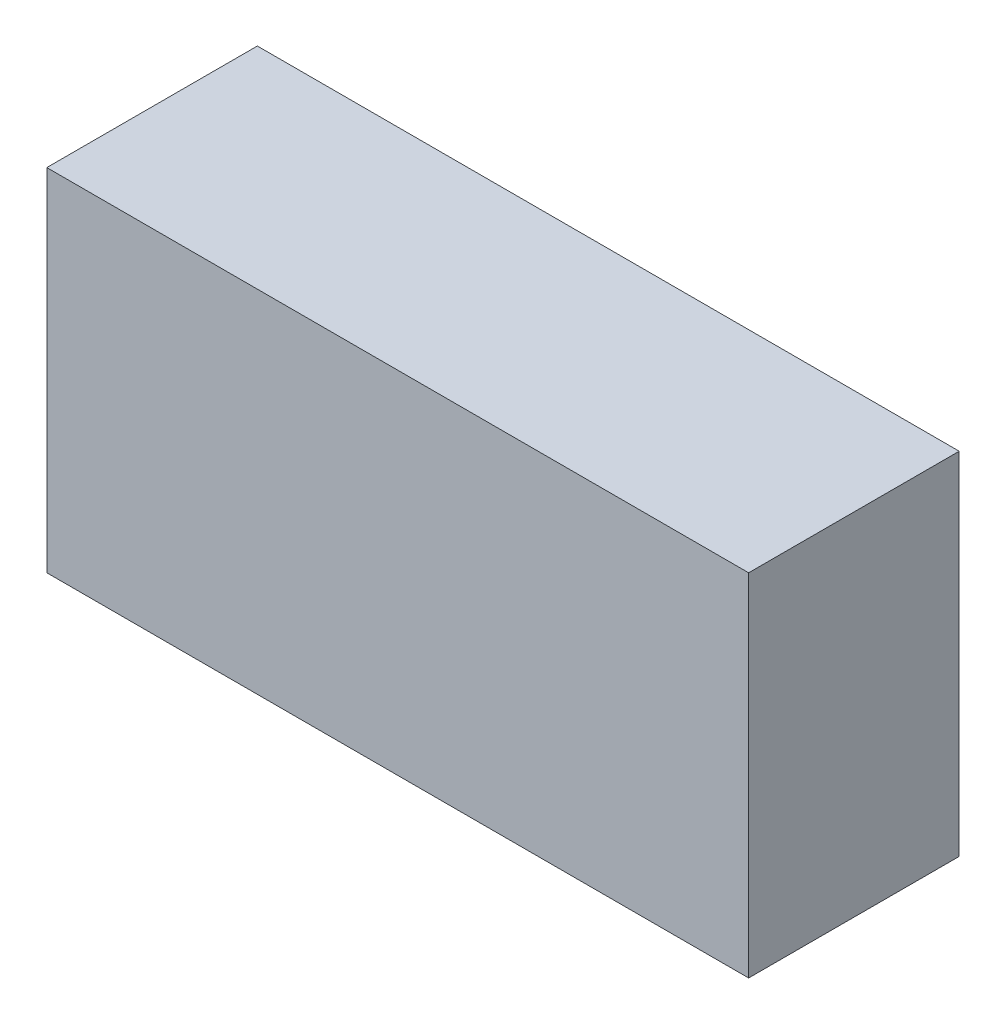
ISO-10303-21;
HEADER;
FILE_DESCRIPTION(('STEP AP214'),'2;1');
FILE_NAME('part.step','',(''),(''),'','','');
FILE_SCHEMA(('AUTOMOTIVE_DESIGN { 1 0 10303 214 1 1 1 1 }'));
ENDSEC;
DATA;
#1=APPLICATION_CONTEXT('core data for automotive mechanical design processes');
#2=APPLICATION_PROTOCOL_DEFINITION('international standard','automotive_design',2000,#1);
#3=PRODUCT_CONTEXT('',#1,'mechanical');
#4=PRODUCT('Part','Part','',(#3));
#5=PRODUCT_RELATED_PRODUCT_CATEGORY('part','',(#4));
#6=PRODUCT_DEFINITION_FORMATION('','',#4);
#7=PRODUCT_DEFINITION_CONTEXT('part definition',#1,'design');
#8=PRODUCT_DEFINITION('design','',#6,#7);
#9=PRODUCT_DEFINITION_SHAPE('','',#8);
#10=(LENGTH_UNIT() NAMED_UNIT(*) SI_UNIT(.MILLI.,.METRE.));
#11=(NAMED_UNIT(*) PLANE_ANGLE_UNIT() SI_UNIT($,.RADIAN.));
#12=(NAMED_UNIT(*) SI_UNIT($,.STERADIAN.) SOLID_ANGLE_UNIT());
#13=UNCERTAINTY_MEASURE_WITH_UNIT(LENGTH_MEASURE(1.E-05),#10,'distance_accuracy_value','');
#14=(GEOMETRIC_REPRESENTATION_CONTEXT(3) GLOBAL_UNCERTAINTY_ASSIGNED_CONTEXT((#13)) GLOBAL_UNIT_ASSIGNED_CONTEXT((#10,
#11,#12)) REPRESENTATION_CONTEXT('',''));
#15=CARTESIAN_POINT('',(0.,0.,0.));
#16=DIRECTION('',(0.,0.,1.));
#17=DIRECTION('',(1.,0.,0.));
#18=AXIS2_PLACEMENT_3D('',#15,#16,#17);
#19=CARTESIAN_POINT('',(50.,-25.,30.));
#20=DIRECTION('',(-1.,0.,0.));
#21=DIRECTION('',(0.,0.,1.));
#22=AXIS2_PLACEMENT_3D('',#19,#20,#21);
#23=PLANE('',#22);
#24=DIRECTION('',(0.,1.,0.));
#25=VECTOR('',#24,1.);
#26=CARTESIAN_POINT('',(50.,-25.,0.));
#27=LINE('',#26,#25);
#28=CARTESIAN_POINT('',(50.,-25.,0.));
#29=VERTEX_POINT('',#28);
#30=CARTESIAN_POINT('',(50.,25.,0.));
#31=VERTEX_POINT('',#30);
#32=EDGE_CURVE('E100',#29,#31,#27,.T.);
#33=ORIENTED_EDGE('',*,*,#32,.T.);
#34=DIRECTION('',(0.,0.,-1.));
#35=VECTOR('',#34,1.);
#36=CARTESIAN_POINT('',(50.,25.,30.));
#37=LINE('',#36,#35);
#38=CARTESIAN_POINT('',(50.,25.,30.));
#39=VERTEX_POINT('',#38);
#40=EDGE_CURVE('E11',#39,#31,#37,.T.);
#41=ORIENTED_EDGE('',*,*,#40,.F.);
#42=DIRECTION('',(0.,1.,0.));
#43=VECTOR('',#42,1.);
#44=CARTESIAN_POINT('',(50.,-25.,30.));
#45=LINE('',#44,#43);
#46=CARTESIAN_POINT('',(50.,-25.,30.));
#47=VERTEX_POINT('',#46);
#48=EDGE_CURVE('E88',#47,#39,#45,.T.);
#49=ORIENTED_EDGE('',*,*,#48,.F.);
#50=DIRECTION('',(0.,0.,-1.));
#51=VECTOR('',#50,1.);
#52=CARTESIAN_POINT('',(50.,-25.,30.));
#53=LINE('',#52,#51);
#54=EDGE_CURVE('E96',#47,#29,#53,.T.);
#55=ORIENTED_EDGE('',*,*,#54,.T.);
#56=EDGE_LOOP('',(#33,#41,#49,#55));
#57=FACE_BOUND('',#56,.T.);
#58=ADVANCED_FACE('F37',(#57),#23,.F.);
#59=CARTESIAN_POINT('',(-50.,25.,30.));
#60=DIRECTION('',(0.,-1.,0.));
#61=DIRECTION('',(0.,0.,-1.));
#62=AXIS2_PLACEMENT_3D('',#59,#60,#61);
#63=PLANE('',#62);
#64=DIRECTION('',(-1.,0.,0.));
#65=VECTOR('',#64,1.);
#66=CARTESIAN_POINT('',(-50.,25.,0.));
#67=LINE('',#66,#65);
#68=CARTESIAN_POINT('',(-50.,25.,0.));
#69=VERTEX_POINT('',#68);
#70=EDGE_CURVE('E92',#31,#69,#67,.T.);
#71=ORIENTED_EDGE('',*,*,#70,.T.);
#72=DIRECTION('',(0.,0.,-1.));
#73=VECTOR('',#72,1.);
#74=CARTESIAN_POINT('',(-50.,25.,30.));
#75=LINE('',#74,#73);
#76=CARTESIAN_POINT('',(-50.,25.,30.));
#77=VERTEX_POINT('',#76);
#78=EDGE_CURVE('E45',#77,#69,#75,.T.);
#79=ORIENTED_EDGE('',*,*,#78,.F.);
#80=DIRECTION('',(-1.,0.,0.));
#81=VECTOR('',#80,1.);
#82=CARTESIAN_POINT('',(-50.,25.,30.));
#83=LINE('',#82,#81);
#84=EDGE_CURVE('E83',#39,#77,#83,.T.);
#85=ORIENTED_EDGE('',*,*,#84,.F.);
#86=ORIENTED_EDGE('',*,*,#40,.T.);
#87=EDGE_LOOP('',(#71,#79,#85,#86));
#88=FACE_BOUND('',#87,.T.);
#89=ADVANCED_FACE('F91',(#88),#63,.F.);
#90=CARTESIAN_POINT('',(-50.,-25.,30.));
#91=DIRECTION('',(1.,0.,0.));
#92=DIRECTION('',(0.,0.,-1.));
#93=AXIS2_PLACEMENT_3D('',#90,#91,#92);
#94=PLANE('',#93);
#95=DIRECTION('',(0.,-1.,0.));
#96=VECTOR('',#95,1.);
#97=CARTESIAN_POINT('',(-50.,-25.,0.));
#98=LINE('',#97,#96);
#99=CARTESIAN_POINT('',(-50.,-25.,0.));
#100=VERTEX_POINT('',#99);
#101=EDGE_CURVE('E70',#69,#100,#98,.T.);
#102=ORIENTED_EDGE('',*,*,#101,.T.);
#103=DIRECTION('',(0.,0.,-1.));
#104=VECTOR('',#103,1.);
#105=CARTESIAN_POINT('',(-50.,-25.,30.));
#106=LINE('',#105,#104);
#107=CARTESIAN_POINT('',(-50.,-25.,30.));
#108=VERTEX_POINT('',#107);
#109=EDGE_CURVE('E93',#108,#100,#106,.T.);
#110=ORIENTED_EDGE('',*,*,#109,.F.);
#111=DIRECTION('',(0.,-1.,0.));
#112=VECTOR('',#111,1.);
#113=CARTESIAN_POINT('',(-50.,-25.,30.));
#114=LINE('',#113,#112);
#115=EDGE_CURVE('E86',#77,#108,#114,.T.);
#116=ORIENTED_EDGE('',*,*,#115,.F.);
#117=ORIENTED_EDGE('',*,*,#78,.T.);
#118=EDGE_LOOP('',(#102,#110,#116,#117));
#119=FACE_BOUND('',#118,.T.);
#120=ADVANCED_FACE('F94',(#119),#94,.F.);
#121=CARTESIAN_POINT('',(-50.,-25.,30.));
#122=DIRECTION('',(0.,1.,0.));
#123=DIRECTION('',(0.,0.,1.));
#124=AXIS2_PLACEMENT_3D('',#121,#122,#123);
#125=PLANE('',#124);
#126=DIRECTION('',(1.,0.,0.));
#127=VECTOR('',#126,1.);
#128=CARTESIAN_POINT('',(-50.,-25.,0.));
#129=LINE('',#128,#127);
#130=EDGE_CURVE('E76',#100,#29,#129,.T.);
#131=ORIENTED_EDGE('',*,*,#130,.T.);
#132=ORIENTED_EDGE('',*,*,#54,.F.);
#133=DIRECTION('',(1.,0.,0.));
#134=VECTOR('',#133,1.);
#135=CARTESIAN_POINT('',(-50.,-25.,30.));
#136=LINE('',#135,#134);
#137=EDGE_CURVE('E53',#108,#47,#136,.T.);
#138=ORIENTED_EDGE('',*,*,#137,.F.);
#139=ORIENTED_EDGE('',*,*,#109,.T.);
#140=EDGE_LOOP('',(#131,#132,#138,#139));
#141=FACE_BOUND('',#140,.T.);
#142=ADVANCED_FACE('F107',(#141),#125,.F.);
#143=CARTESIAN_POINT('',(0.,0.,30.));
#144=DIRECTION('',(0.,0.,-1.));
#145=DIRECTION('',(-1.,0.,0.));
#146=AXIS2_PLACEMENT_3D('',#143,#144,#145);
#147=PLANE('',#146);
#148=ORIENTED_EDGE('',*,*,#48,.T.);
#149=ORIENTED_EDGE('',*,*,#84,.T.);
#150=ORIENTED_EDGE('',*,*,#115,.T.);
#151=ORIENTED_EDGE('',*,*,#137,.T.);
#152=EDGE_LOOP('',(#148,#149,#150,#151));
#153=FACE_BOUND('',#152,.T.);
#154=ADVANCED_FACE('F84',(#153),#147,.F.);
#155=CARTESIAN_POINT('',(0.,0.,0.));
#156=DIRECTION('',(0.,0.,-1.));
#157=DIRECTION('',(-1.,0.,0.));
#158=AXIS2_PLACEMENT_3D('',#155,#156,#157);
#159=PLANE('',#158);
#160=ORIENTED_EDGE('',*,*,#32,.F.);
#161=ORIENTED_EDGE('',*,*,#130,.F.);
#162=ORIENTED_EDGE('',*,*,#101,.F.);
#163=ORIENTED_EDGE('',*,*,#70,.F.);
#164=EDGE_LOOP('',(#160,#161,#162,#163));
#165=FACE_BOUND('',#164,.T.);
#166=ADVANCED_FACE('F110',(#165),#159,.T.);
#167=CLOSED_SHELL('',(#58,#89,#120,#142,#154,#166));
#168=MANIFOLD_SOLID_BREP('B2',#167);
#169=ADVANCED_BREP_SHAPE_REPRESENTATION('',(#18,#168),#14);
#170=SHAPE_DEFINITION_REPRESENTATION(#9,#169);
ENDSEC;
END-ISO-10303-21;
